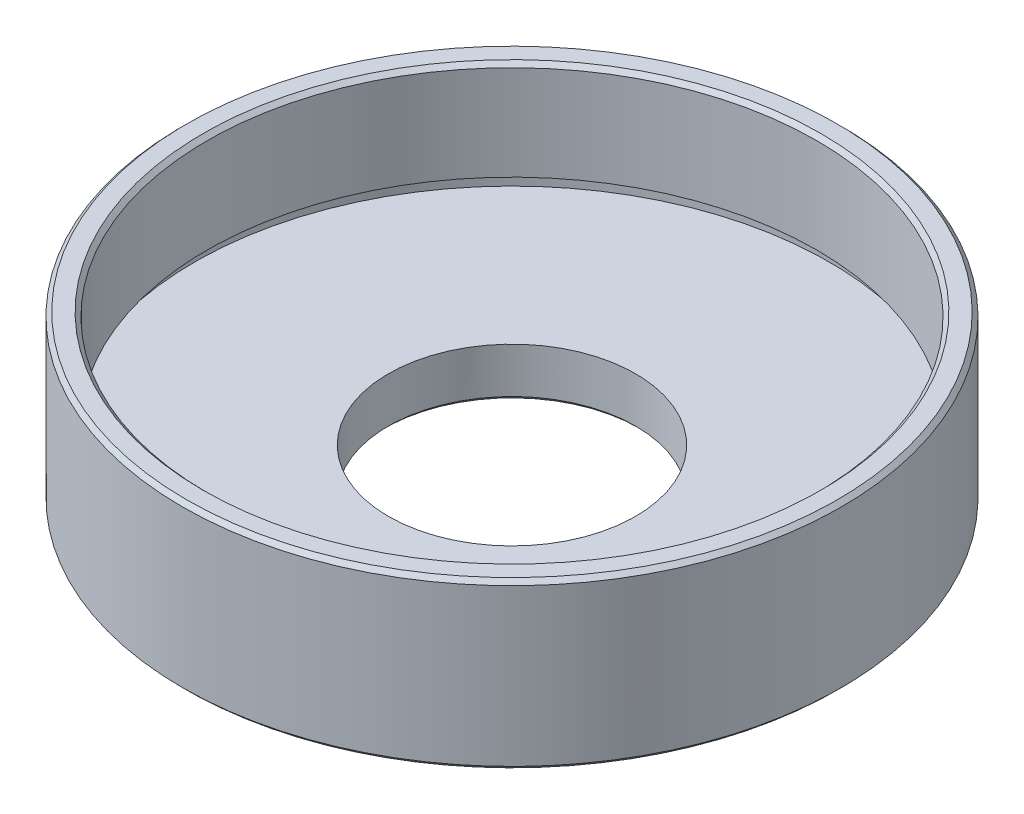
ISO-10303-21;
HEADER;
FILE_DESCRIPTION(('STEP AP214'),'2;1');
FILE_NAME('part.step','',(''),(''),'','','');
FILE_SCHEMA(('AUTOMOTIVE_DESIGN { 1 0 10303 214 1 1 1 1 }'));
ENDSEC;
DATA;
#1=APPLICATION_CONTEXT('core data for automotive mechanical design processes');
#2=APPLICATION_PROTOCOL_DEFINITION('international standard','automotive_design',2000,#1);
#3=PRODUCT_CONTEXT('',#1,'mechanical');
#4=PRODUCT('Part','Part','',(#3));
#5=PRODUCT_RELATED_PRODUCT_CATEGORY('part','',(#4));
#6=PRODUCT_DEFINITION_FORMATION('','',#4);
#7=PRODUCT_DEFINITION_CONTEXT('part definition',#1,'design');
#8=PRODUCT_DEFINITION('design','',#6,#7);
#9=PRODUCT_DEFINITION_SHAPE('','',#8);
#10=(LENGTH_UNIT() NAMED_UNIT(*) SI_UNIT(.MILLI.,.METRE.));
#11=(NAMED_UNIT(*) PLANE_ANGLE_UNIT() SI_UNIT($,.RADIAN.));
#12=(NAMED_UNIT(*) SI_UNIT($,.STERADIAN.) SOLID_ANGLE_UNIT());
#13=UNCERTAINTY_MEASURE_WITH_UNIT(LENGTH_MEASURE(1.E-05),#10,'distance_accuracy_value','');
#14=(GEOMETRIC_REPRESENTATION_CONTEXT(3) GLOBAL_UNCERTAINTY_ASSIGNED_CONTEXT((#13)) GLOBAL_UNIT_ASSIGNED_CONTEXT((#10,
#11,#12)) REPRESENTATION_CONTEXT('',''));
#15=CARTESIAN_POINT('',(0.,0.,0.));
#16=DIRECTION('',(0.,0.,1.));
#17=DIRECTION('',(1.,0.,0.));
#18=AXIS2_PLACEMENT_3D('',#15,#16,#17);
#19=CARTESIAN_POINT('',(37.,20.,-2.58369619074392E-13));
#20=DIRECTION('',(0.,1.,0.));
#21=DIRECTION('',(0.,0.,1.));
#22=AXIS2_PLACEMENT_3D('',#19,#20,#21);
#23=PLANE('',#22);
#24=CARTESIAN_POINT('',(0.,20.,0.));
#25=DIRECTION('',(0.,1.,0.));
#26=DIRECTION('',(0.,0.,1.));
#27=AXIS2_PLACEMENT_3D('',#24,#25,#26);
#28=CIRCLE('',#27,39.5);
#29=CARTESIAN_POINT('',(0.,20.,39.5));
#30=VERTEX_POINT('',#29);
#31=EDGE_CURVE('E42',#30,#30,#28,.T.);
#32=ORIENTED_EDGE('',*,*,#31,.T.);
#33=EDGE_LOOP('',(#32));
#34=FACE_BOUND('',#33,.T.);
#35=CARTESIAN_POINT('',(0.,20.,0.));
#36=DIRECTION('',(0.,1.,0.));
#37=DIRECTION('',(0.,0.,1.));
#38=AXIS2_PLACEMENT_3D('',#35,#36,#37);
#39=CIRCLE('',#38,37.5);
#40=CARTESIAN_POINT('',(0.,20.,37.5));
#41=VERTEX_POINT('',#40);
#42=EDGE_CURVE('E46',#41,#41,#39,.F.);
#43=ORIENTED_EDGE('',*,*,#42,.T.);
#44=EDGE_LOOP('',(#43));
#45=FACE_BOUND('',#44,.T.);
#46=ADVANCED_FACE('F35',(#34,#45),#23,.T.);
#47=CARTESIAN_POINT('',(0.,26.1689859870494,0.));
#48=DIRECTION('',(0.,1.,0.));
#49=DIRECTION('',(0.,0.,1.));
#50=AXIS2_PLACEMENT_3D('',#47,#48,#49);
#51=CYLINDRICAL_SURFACE('',#50,40.);
#52=CARTESIAN_POINT('',(0.,0.5,0.));
#53=DIRECTION('',(0.,-1.,0.));
#54=DIRECTION('',(0.,0.,-1.));
#55=AXIS2_PLACEMENT_3D('',#52,#53,#54);
#56=CIRCLE('',#55,40.);
#57=CARTESIAN_POINT('',(0.,0.5,-40.));
#58=VERTEX_POINT('',#57);
#59=EDGE_CURVE('E50',#58,#58,#56,.F.);
#60=ORIENTED_EDGE('',*,*,#59,.T.);
#61=EDGE_LOOP('',(#60));
#62=FACE_BOUND('',#61,.T.);
#63=CARTESIAN_POINT('',(0.,19.5,0.));
#64=DIRECTION('',(0.,1.,0.));
#65=DIRECTION('',(0.,0.,1.));
#66=AXIS2_PLACEMENT_3D('',#63,#64,#65);
#67=CIRCLE('',#66,40.);
#68=CARTESIAN_POINT('',(0.,19.5,40.));
#69=VERTEX_POINT('',#68);
#70=EDGE_CURVE('E55',#69,#69,#67,.F.);
#71=ORIENTED_EDGE('',*,*,#70,.T.);
#72=EDGE_LOOP('',(#71));
#73=FACE_BOUND('',#72,.T.);
#74=ADVANCED_FACE('F97',(#62,#73),#51,.T.);
#75=CARTESIAN_POINT('',(40.,0.,-2.79318507107451E-13));
#76=DIRECTION('',(0.,-1.,0.));
#77=DIRECTION('',(0.,0.,-1.));
#78=AXIS2_PLACEMENT_3D('',#75,#76,#77);
#79=PLANE('',#78);
#80=CARTESIAN_POINT('',(0.,0.,0.));
#81=DIRECTION('',(0.,-1.,0.));
#82=DIRECTION('',(0.,0.,-1.));
#83=AXIS2_PLACEMENT_3D('',#80,#81,#82);
#84=CIRCLE('',#83,15.5);
#85=CARTESIAN_POINT('',(0.,0.,-15.5));
#86=VERTEX_POINT('',#85);
#87=EDGE_CURVE('E61',#86,#86,#84,.F.);
#88=ORIENTED_EDGE('',*,*,#87,.T.);
#89=EDGE_LOOP('',(#88));
#90=FACE_BOUND('',#89,.T.);
#91=CARTESIAN_POINT('',(0.,0.,0.));
#92=DIRECTION('',(0.,-1.,0.));
#93=DIRECTION('',(0.,0.,-1.));
#94=AXIS2_PLACEMENT_3D('',#91,#92,#93);
#95=CIRCLE('',#94,39.5);
#96=CARTESIAN_POINT('',(0.,0.,-39.5));
#97=VERTEX_POINT('',#96);
#98=EDGE_CURVE('E64',#97,#97,#95,.T.);
#99=ORIENTED_EDGE('',*,*,#98,.T.);
#100=EDGE_LOOP('',(#99));
#101=FACE_BOUND('',#100,.T.);
#102=ADVANCED_FACE('F102',(#90,#101),#79,.T.);
#103=CARTESIAN_POINT('',(0.,26.1689859870494,0.));
#104=DIRECTION('',(0.,1.,0.));
#105=DIRECTION('',(0.,0.,1.));
#106=AXIS2_PLACEMENT_3D('',#103,#104,#105);
#107=CYLINDRICAL_SURFACE('',#106,15.);
#108=CARTESIAN_POINT('',(0.,0.499999999999994,0.));
#109=DIRECTION('',(0.,-1.,0.));
#110=DIRECTION('',(0.,0.,-1.));
#111=AXIS2_PLACEMENT_3D('',#108,#109,#110);
#112=CIRCLE('',#111,15.);
#113=CARTESIAN_POINT('',(0.,0.499999999999994,-15.));
#114=VERTEX_POINT('',#113);
#115=EDGE_CURVE('E58',#114,#114,#112,.T.);
#116=ORIENTED_EDGE('',*,*,#115,.T.);
#117=EDGE_LOOP('',(#116));
#118=FACE_BOUND('',#117,.T.);
#119=CARTESIAN_POINT('',(0.,6.,0.));
#120=DIRECTION('',(0.,1.,0.));
#121=DIRECTION('',(0.,0.,1.));
#122=AXIS2_PLACEMENT_3D('',#119,#120,#121);
#123=CIRCLE('',#122,15.);
#124=CARTESIAN_POINT('',(0.,6.,15.));
#125=VERTEX_POINT('',#124);
#126=EDGE_CURVE('E67',#125,#125,#123,.T.);
#127=ORIENTED_EDGE('',*,*,#126,.T.);
#128=EDGE_LOOP('',(#127));
#129=FACE_BOUND('',#128,.T.);
#130=ADVANCED_FACE('F153',(#118,#129),#107,.F.);
#131=CARTESIAN_POINT('',(15.,6.,-1.04744440165294E-13));
#132=DIRECTION('',(0.,1.,0.));
#133=DIRECTION('',(0.,0.,1.));
#134=AXIS2_PLACEMENT_3D('',#131,#132,#133);
#135=PLANE('',#134);
#136=CARTESIAN_POINT('',(0.,6.,0.));
#137=DIRECTION('',(0.,1.,0.));
#138=DIRECTION('',(0.,0.,1.));
#139=AXIS2_PLACEMENT_3D('',#136,#137,#138);
#140=CIRCLE('',#139,38.5);
#141=CARTESIAN_POINT('',(0.,6.,38.5));
#142=VERTEX_POINT('',#141);
#143=EDGE_CURVE('E70',#142,#142,#140,.T.);
#144=ORIENTED_EDGE('',*,*,#143,.T.);
#145=EDGE_LOOP('',(#144));
#146=FACE_BOUND('',#145,.T.);
#147=ORIENTED_EDGE('',*,*,#126,.F.);
#148=EDGE_LOOP('',(#147));
#149=FACE_BOUND('',#148,.T.);
#150=ADVANCED_FACE('F158',(#146,#149),#135,.T.);
#151=CARTESIAN_POINT('',(0.,26.1689859870494,0.));
#152=DIRECTION('',(0.,1.,0.));
#153=DIRECTION('',(0.,0.,1.));
#154=AXIS2_PLACEMENT_3D('',#151,#152,#153);
#155=CYLINDRICAL_SURFACE('',#154,38.5);
#156=CARTESIAN_POINT('',(0.,8.,0.));
#157=DIRECTION('',(0.,1.,0.));
#158=DIRECTION('',(0.,0.,1.));
#159=AXIS2_PLACEMENT_3D('',#156,#157,#158);
#160=CIRCLE('',#159,38.5);
#161=CARTESIAN_POINT('',(0.,8.,38.5));
#162=VERTEX_POINT('',#161);
#163=EDGE_CURVE('E73',#162,#162,#160,.T.);
#164=ORIENTED_EDGE('',*,*,#163,.T.);
#165=EDGE_LOOP('',(#164));
#166=FACE_BOUND('',#165,.T.);
#167=ORIENTED_EDGE('',*,*,#143,.F.);
#168=EDGE_LOOP('',(#167));
#169=FACE_BOUND('',#168,.T.);
#170=ADVANCED_FACE('F94',(#166,#169),#155,.F.);
#171=CARTESIAN_POINT('',(38.5,8.,-2.68844063090921E-13));
#172=DIRECTION('',(0.,-1.,0.));
#173=DIRECTION('',(0.,0.,-1.));
#174=AXIS2_PLACEMENT_3D('',#171,#172,#173);
#175=PLANE('',#174);
#176=CARTESIAN_POINT('',(0.,8.,0.));
#177=DIRECTION('',(0.,1.,0.));
#178=DIRECTION('',(0.,0.,1.));
#179=AXIS2_PLACEMENT_3D('',#176,#177,#178);
#180=CIRCLE('',#179,37.);
#181=CARTESIAN_POINT('',(0.,8.,37.));
#182=VERTEX_POINT('',#181);
#183=EDGE_CURVE('E76',#182,#182,#180,.T.);
#184=ORIENTED_EDGE('',*,*,#183,.T.);
#185=EDGE_LOOP('',(#184));
#186=FACE_BOUND('',#185,.T.);
#187=ORIENTED_EDGE('',*,*,#163,.F.);
#188=EDGE_LOOP('',(#187));
#189=FACE_BOUND('',#188,.T.);
#190=ADVANCED_FACE('F80',(#186,#189),#175,.T.);
#191=CARTESIAN_POINT('',(0.,26.1689859870494,0.));
#192=DIRECTION('',(0.,1.,0.));
#193=DIRECTION('',(0.,0.,1.));
#194=AXIS2_PLACEMENT_3D('',#191,#192,#193);
#195=CYLINDRICAL_SURFACE('',#194,37.);
#196=CARTESIAN_POINT('',(0.,19.5,0.));
#197=DIRECTION('',(0.,1.,0.));
#198=DIRECTION('',(0.,0.,1.));
#199=AXIS2_PLACEMENT_3D('',#196,#197,#198);
#200=CIRCLE('',#199,37.);
#201=CARTESIAN_POINT('',(0.,19.5,37.));
#202=VERTEX_POINT('',#201);
#203=EDGE_CURVE('E10',#202,#202,#200,.T.);
#204=ORIENTED_EDGE('',*,*,#203,.T.);
#205=EDGE_LOOP('',(#204));
#206=FACE_BOUND('',#205,.T.);
#207=ORIENTED_EDGE('',*,*,#183,.F.);
#208=EDGE_LOOP('',(#207));
#209=FACE_BOUND('',#208,.T.);
#210=ADVANCED_FACE('F83',(#206,#209),#195,.F.);
#211=CARTESIAN_POINT('',(0.,0.,0.));
#212=DIRECTION('',(0.,-1.,0.));
#213=DIRECTION('',(0.,0.,-1.));
#214=AXIS2_PLACEMENT_3D('',#211,#212,#213);
#215=CONICAL_SURFACE('',#214,15.5,0.785398163397445);
#216=ORIENTED_EDGE('',*,*,#115,.F.);
#217=EDGE_LOOP('',(#216));
#218=FACE_BOUND('',#217,.T.);
#219=ORIENTED_EDGE('',*,*,#87,.F.);
#220=EDGE_LOOP('',(#219));
#221=FACE_BOUND('',#220,.T.);
#222=ADVANCED_FACE('F85',(#218,#221),#215,.F.);
#223=CARTESIAN_POINT('',(0.,0.5,0.));
#224=DIRECTION('',(0.,1.,0.));
#225=DIRECTION('',(0.,0.,1.));
#226=AXIS2_PLACEMENT_3D('',#223,#224,#225);
#227=CONICAL_SURFACE('',#226,40.,0.785398163397441);
#228=ORIENTED_EDGE('',*,*,#98,.F.);
#229=EDGE_LOOP('',(#228));
#230=FACE_BOUND('',#229,.T.);
#231=ORIENTED_EDGE('',*,*,#59,.F.);
#232=EDGE_LOOP('',(#231));
#233=FACE_BOUND('',#232,.T.);
#234=ADVANCED_FACE('F91',(#230,#233),#227,.T.);
#235=CARTESIAN_POINT('',(0.,20.,0.));
#236=DIRECTION('',(0.,-1.,0.));
#237=DIRECTION('',(0.,0.,-1.));
#238=AXIS2_PLACEMENT_3D('',#235,#236,#237);
#239=CONICAL_SURFACE('',#238,39.5,0.785398163397448);
#240=ORIENTED_EDGE('',*,*,#70,.F.);
#241=EDGE_LOOP('',(#240));
#242=FACE_BOUND('',#241,.T.);
#243=ORIENTED_EDGE('',*,*,#31,.F.);
#244=EDGE_LOOP('',(#243));
#245=FACE_BOUND('',#244,.T.);
#246=ADVANCED_FACE('F109',(#242,#245),#239,.T.);
#247=CARTESIAN_POINT('',(0.,19.5,0.));
#248=DIRECTION('',(0.,1.,0.));
#249=DIRECTION('',(0.,0.,1.));
#250=AXIS2_PLACEMENT_3D('',#247,#248,#249);
#251=CONICAL_SURFACE('',#250,37.,0.785398163397469);
#252=ORIENTED_EDGE('',*,*,#42,.F.);
#253=EDGE_LOOP('',(#252));
#254=FACE_BOUND('',#253,.T.);
#255=ORIENTED_EDGE('',*,*,#203,.F.);
#256=EDGE_LOOP('',(#255));
#257=FACE_BOUND('',#256,.T.);
#258=ADVANCED_FACE('F37',(#254,#257),#251,.F.);
#259=CLOSED_SHELL('',(#46,#74,#102,#130,#150,#170,#190,#210,#222,#234,#246,#258));
#260=MANIFOLD_SOLID_BREP('B2',#259);
#261=ADVANCED_BREP_SHAPE_REPRESENTATION('',(#18,#260),#14);
#262=SHAPE_DEFINITION_REPRESENTATION(#9,#261);
ENDSEC;
END-ISO-10303-21;
